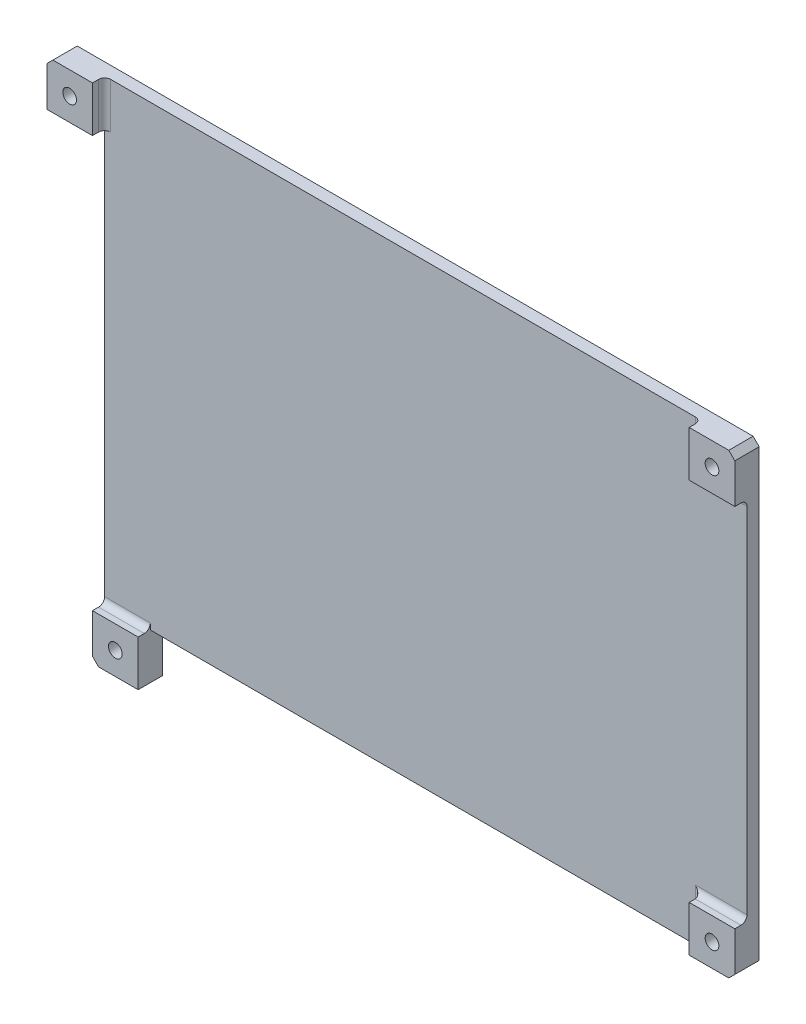
ISO-10303-21;
HEADER;
FILE_DESCRIPTION(('STEP AP214'),'2;1');
FILE_NAME('part.step','',(''),(''),'','','');
FILE_SCHEMA(('AUTOMOTIVE_DESIGN { 1 0 10303 214 1 1 1 1 }'));
ENDSEC;
DATA;
#1=APPLICATION_CONTEXT('core data for automotive mechanical design processes');
#2=APPLICATION_PROTOCOL_DEFINITION('international standard','automotive_design',2000,#1);
#3=PRODUCT_CONTEXT('',#1,'mechanical');
#4=PRODUCT('Part','Part','',(#3));
#5=PRODUCT_RELATED_PRODUCT_CATEGORY('part','',(#4));
#6=PRODUCT_DEFINITION_FORMATION('','',#4);
#7=PRODUCT_DEFINITION_CONTEXT('part definition',#1,'design');
#8=PRODUCT_DEFINITION('design','',#6,#7);
#9=PRODUCT_DEFINITION_SHAPE('','',#8);
#10=(LENGTH_UNIT() NAMED_UNIT(*) SI_UNIT(.MILLI.,.METRE.));
#11=(NAMED_UNIT(*) PLANE_ANGLE_UNIT() SI_UNIT($,.RADIAN.));
#12=(NAMED_UNIT(*) SI_UNIT($,.STERADIAN.) SOLID_ANGLE_UNIT());
#13=UNCERTAINTY_MEASURE_WITH_UNIT(LENGTH_MEASURE(1.E-05),#10,'distance_accuracy_value','');
#14=(GEOMETRIC_REPRESENTATION_CONTEXT(3) GLOBAL_UNCERTAINTY_ASSIGNED_CONTEXT((#13)) GLOBAL_UNIT_ASSIGNED_CONTEXT((#10,
#11,#12)) REPRESENTATION_CONTEXT('',''));
#15=CARTESIAN_POINT('',(0.,0.,0.));
#16=DIRECTION('',(0.,0.,1.));
#17=DIRECTION('',(1.,0.,0.));
#18=AXIS2_PLACEMENT_3D('',#15,#16,#17);
#19=CARTESIAN_POINT('',(0.,0.,2.));
#20=DIRECTION('',(0.,0.,1.));
#21=DIRECTION('',(1.,0.,0.));
#22=AXIS2_PLACEMENT_3D('',#19,#20,#21);
#23=PLANE('',#22);
#24=DIRECTION('',(0.,1.,0.));
#25=VECTOR('',#24,1.);
#26=CARTESIAN_POINT('',(62.0588235294117,24.5025354969574,2.));
#27=LINE('',#26,#25);
#28=CARTESIAN_POINT('',(62.0588235294118,-42.0574645030426,2.));
#29=VERTEX_POINT('',#28);
#30=CARTESIAN_POINT('',(62.0588235294117,16.0025354969574,2.));
#31=VERTEX_POINT('',#30);
#32=EDGE_CURVE('E288',#29,#31,#27,.T.);
#33=ORIENTED_EDGE('',*,*,#32,.T.);
#34=DIRECTION('',(1.,0.,0.));
#35=VECTOR('',#34,1.);
#36=CARTESIAN_POINT('',(0.,16.0025354969574,2.));
#37=LINE('',#36,#35);
#38=CARTESIAN_POINT('',(53.5588235294117,16.0025354969574,2.));
#39=VERTEX_POINT('',#38);
#40=EDGE_CURVE('E428',#31,#39,#37,.F.);
#41=ORIENTED_EDGE('',*,*,#40,.T.);
#42=DIRECTION('',(0.,-1.,0.));
#43=VECTOR('',#42,1.);
#44=CARTESIAN_POINT('',(53.5588235294117,0.,2.));
#45=LINE('',#44,#43);
#46=CARTESIAN_POINT('',(53.5588235294117,24.5025354969574,2.));
#47=VERTEX_POINT('',#46);
#48=EDGE_CURVE('E431',#39,#47,#45,.F.);
#49=ORIENTED_EDGE('',*,*,#48,.T.);
#50=DIRECTION('',(-1.,0.,0.));
#51=VECTOR('',#50,1.);
#52=CARTESIAN_POINT('',(-43.4411764705882,24.5025354969574,2.));
#53=LINE('',#52,#51);
#54=CARTESIAN_POINT('',(-42.4411764705882,24.5025354969574,2.));
#55=VERTEX_POINT('',#54);
#56=EDGE_CURVE('E281',#47,#55,#53,.T.);
#57=ORIENTED_EDGE('',*,*,#56,.T.);
#58=DIRECTION('',(0.,-1.,0.));
#59=VECTOR('',#58,1.);
#60=CARTESIAN_POINT('',(-42.4411764705882,0.,2.));
#61=LINE('',#60,#59);
#62=CARTESIAN_POINT('',(-42.4411764705882,17.0025354969574,2.));
#63=VERTEX_POINT('',#62);
#64=EDGE_CURVE('E278',#55,#63,#61,.T.);
#65=ORIENTED_EDGE('',*,*,#64,.T.);
#66=DIRECTION('',(-1.,0.,0.));
#67=VECTOR('',#66,1.);
#68=CARTESIAN_POINT('',(0.,17.0025354969574,2.));
#69=LINE('',#68,#67);
#70=CARTESIAN_POINT('',(-43.4411764705882,17.0025354969574,2.));
#71=VERTEX_POINT('',#70);
#72=EDGE_CURVE('E269',#63,#71,#69,.T.);
#73=ORIENTED_EDGE('',*,*,#72,.T.);
#74=DIRECTION('',(0.,-1.,0.));
#75=VECTOR('',#74,1.);
#76=CARTESIAN_POINT('',(-43.4411764705882,24.5025354969574,2.));
#77=LINE('',#76,#75);
#78=CARTESIAN_POINT('',(-43.4411764705882,-49.5574645030426,2.));
#79=VERTEX_POINT('',#78);
#80=EDGE_CURVE('E481',#71,#79,#77,.T.);
#81=ORIENTED_EDGE('',*,*,#80,.T.);
#82=DIRECTION('',(1.,0.,0.));
#83=VECTOR('',#82,1.);
#84=CARTESIAN_POINT('',(0.,-49.5574645030426,2.));
#85=LINE('',#84,#83);
#86=CARTESIAN_POINT('',(-35.9411764705882,-49.5574645030426,2.));
#87=VERTEX_POINT('',#86);
#88=EDGE_CURVE('E461',#79,#87,#85,.T.);
#89=ORIENTED_EDGE('',*,*,#88,.T.);
#90=DIRECTION('',(0.,-1.,0.));
#91=VECTOR('',#90,1.);
#92=CARTESIAN_POINT('',(-35.9411764705882,0.,2.));
#93=LINE('',#92,#91);
#94=CARTESIAN_POINT('',(-35.9411764705882,-50.5574645030426,2.));
#95=VERTEX_POINT('',#94);
#96=EDGE_CURVE('E465',#87,#95,#93,.T.);
#97=ORIENTED_EDGE('',*,*,#96,.T.);
#98=DIRECTION('',(1.,0.,0.));
#99=VECTOR('',#98,1.);
#100=CARTESIAN_POINT('',(-43.4411764705882,-50.5574645030426,2.));
#101=LINE('',#100,#99);
#102=CARTESIAN_POINT('',(53.5588235294118,-50.5574645030426,2.));
#103=VERTEX_POINT('',#102);
#104=EDGE_CURVE('E496',#95,#103,#101,.T.);
#105=ORIENTED_EDGE('',*,*,#104,.T.);
#106=DIRECTION('',(0.,-1.,0.));
#107=VECTOR('',#106,1.);
#108=CARTESIAN_POINT('',(53.5588235294117,0.,2.));
#109=LINE('',#108,#107);
#110=CARTESIAN_POINT('',(53.5588235294117,-42.0574645030426,2.));
#111=VERTEX_POINT('',#110);
#112=EDGE_CURVE('E434',#103,#111,#109,.F.);
#113=ORIENTED_EDGE('',*,*,#112,.T.);
#114=DIRECTION('',(-1.,0.,0.));
#115=VECTOR('',#114,1.);
#116=CARTESIAN_POINT('',(0.,-42.0574645030426,2.));
#117=LINE('',#116,#115);
#118=EDGE_CURVE('E437',#111,#29,#117,.F.);
#119=ORIENTED_EDGE('',*,*,#118,.T.);
#120=EDGE_LOOP('',(#33,#41,#49,#57,#65,#73,#81,#89,#97,#105,#113,#119));
#121=FACE_BOUND('',#120,.T.);
#122=ADVANCED_FACE('F47',(#121),#23,.T.);
#123=CARTESIAN_POINT('',(-43.4411764705882,24.5025354969574,2.));
#124=DIRECTION('',(1.,0.,0.));
#125=DIRECTION('',(0.,1.,0.));
#126=AXIS2_PLACEMENT_3D('',#123,#124,#125);
#127=PLANE('',#126);
#128=DIRECTION('',(0.,-1.,0.));
#129=VECTOR('',#128,1.);
#130=CARTESIAN_POINT('',(-43.4411764705882,24.5025354969574,0.));
#131=LINE('',#130,#129);
#132=CARTESIAN_POINT('',(-43.4411764705882,17.0025354969574,0.));
#133=VERTEX_POINT('',#132);
#134=CARTESIAN_POINT('',(-43.4411764705882,-57.0574645030426,0.));
#135=VERTEX_POINT('',#134);
#136=EDGE_CURVE('E489',#133,#135,#131,.T.);
#137=ORIENTED_EDGE('',*,*,#136,.T.);
#138=DIRECTION('',(0.,0.,1.));
#139=VECTOR('',#138,1.);
#140=CARTESIAN_POINT('',(-43.4411764705882,-57.0574645030426,2.));
#141=LINE('',#140,#139);
#142=CARTESIAN_POINT('',(-43.4411764705882,-57.0574645030426,4.));
#143=VERTEX_POINT('',#142);
#144=EDGE_CURVE('E70',#135,#143,#141,.T.);
#145=ORIENTED_EDGE('',*,*,#144,.T.);
#146=DIRECTION('',(0.,-1.,0.));
#147=VECTOR('',#146,1.);
#148=CARTESIAN_POINT('',(-43.4411764705882,-58.0574645030426,4.));
#149=LINE('',#148,#147);
#150=CARTESIAN_POINT('',(-43.4411764705882,-50.5574645030426,4.));
#151=VERTEX_POINT('',#150);
#152=EDGE_CURVE('E239',#151,#143,#149,.T.);
#153=ORIENTED_EDGE('',*,*,#152,.F.);
#154=DIRECTION('',(0.,0.,-1.));
#155=VECTOR('',#154,1.);
#156=CARTESIAN_POINT('',(-43.4411764705882,-50.5574645030426,4.));
#157=LINE('',#156,#155);
#158=CARTESIAN_POINT('',(-43.4411764705882,-50.5574645030426,3.));
#159=VERTEX_POINT('',#158);
#160=EDGE_CURVE('E236',#151,#159,#157,.T.);
#161=ORIENTED_EDGE('',*,*,#160,.T.);
#162=CARTESIAN_POINT('',(-43.4411764705882,-49.5574645030426,3.));
#163=DIRECTION('',(1.,0.,0.));
#164=DIRECTION('',(0.,1.,0.));
#165=AXIS2_PLACEMENT_3D('',#162,#163,#164);
#166=CIRCLE('',#165,1.);
#167=EDGE_CURVE('E450',#159,#79,#166,.T.);
#168=ORIENTED_EDGE('',*,*,#167,.T.);
#169=ORIENTED_EDGE('',*,*,#80,.F.);
#170=DIRECTION('',(0.,0.,-1.));
#171=VECTOR('',#170,1.);
#172=CARTESIAN_POINT('',(-43.4411764705882,17.0025354969574,4.));
#173=LINE('',#172,#171);
#174=EDGE_CURVE('E270',#71,#133,#173,.T.);
#175=ORIENTED_EDGE('',*,*,#174,.T.);
#176=EDGE_LOOP('',(#137,#145,#153,#161,#168,#169,#175));
#177=FACE_BOUND('',#176,.T.);
#178=ADVANCED_FACE('F634',(#177),#127,.F.);
#179=CARTESIAN_POINT('',(-43.4411764705882,-50.5574645030426,2.));
#180=DIRECTION('',(0.,1.,0.));
#181=DIRECTION('',(0.,0.,1.));
#182=AXIS2_PLACEMENT_3D('',#179,#180,#181);
#183=PLANE('',#182);
#184=DIRECTION('',(1.,0.,0.));
#185=VECTOR('',#184,1.);
#186=CARTESIAN_POINT('',(-43.4411764705882,-50.5574645030426,0.));
#187=LINE('',#186,#185);
#188=CARTESIAN_POINT('',(-35.9411764705882,-50.5574645030426,0.));
#189=VERTEX_POINT('',#188);
#190=CARTESIAN_POINT('',(61.0588235294118,-50.5574645030426,0.));
#191=VERTEX_POINT('',#190);
#192=EDGE_CURVE('E486',#189,#191,#187,.T.);
#193=ORIENTED_EDGE('',*,*,#192,.T.);
#194=DIRECTION('',(0.,0.,1.));
#195=VECTOR('',#194,1.);
#196=CARTESIAN_POINT('',(61.0588235294118,-50.5574645030426,2.));
#197=LINE('',#196,#195);
#198=CARTESIAN_POINT('',(61.0588235294118,-50.5574645030426,4.));
#199=VERTEX_POINT('',#198);
#200=EDGE_CURVE('E367',#191,#199,#197,.T.);
#201=ORIENTED_EDGE('',*,*,#200,.T.);
#202=DIRECTION('',(1.,0.,0.));
#203=VECTOR('',#202,1.);
#204=CARTESIAN_POINT('',(54.5588235294117,-50.5574645030426,4.));
#205=LINE('',#204,#203);
#206=CARTESIAN_POINT('',(54.5588235294117,-50.5574645030426,4.));
#207=VERTEX_POINT('',#206);
#208=EDGE_CURVE('E536',#207,#199,#205,.T.);
#209=ORIENTED_EDGE('',*,*,#208,.F.);
#210=DIRECTION('',(0.,0.,-1.));
#211=VECTOR('',#210,1.);
#212=CARTESIAN_POINT('',(54.5588235294117,-50.5574645030426,4.));
#213=LINE('',#212,#211);
#214=CARTESIAN_POINT('',(54.5588235294117,-50.5574645030426,3.));
#215=VERTEX_POINT('',#214);
#216=EDGE_CURVE('E475',#207,#215,#213,.T.);
#217=ORIENTED_EDGE('',*,*,#216,.T.);
#218=CARTESIAN_POINT('',(53.5588235294117,-50.5574645030426,3.));
#219=DIRECTION('',(0.,1.,0.));
#220=DIRECTION('',(0.,0.,1.));
#221=AXIS2_PLACEMENT_3D('',#218,#219,#220);
#222=CIRCLE('',#221,1.);
#223=EDGE_CURVE('E409',#215,#103,#222,.T.);
#224=ORIENTED_EDGE('',*,*,#223,.T.);
#225=ORIENTED_EDGE('',*,*,#104,.F.);
#226=DIRECTION('',(0.,0.,-1.));
#227=VECTOR('',#226,1.);
#228=CARTESIAN_POINT('',(-35.9411764705882,-50.5574645030426,4.));
#229=LINE('',#228,#227);
#230=EDGE_CURVE('E258',#95,#189,#229,.T.);
#231=ORIENTED_EDGE('',*,*,#230,.T.);
#232=EDGE_LOOP('',(#193,#201,#209,#217,#224,#225,#231));
#233=FACE_BOUND('',#232,.T.);
#234=ADVANCED_FACE('F639',(#233),#183,.F.);
#235=CARTESIAN_POINT('',(62.0588235294117,24.5025354969574,2.));
#236=DIRECTION('',(-1.,0.,0.));
#237=DIRECTION('',(0.,-1.,0.));
#238=AXIS2_PLACEMENT_3D('',#235,#236,#237);
#239=PLANE('',#238);
#240=DIRECTION('',(0.,1.,0.));
#241=VECTOR('',#240,1.);
#242=CARTESIAN_POINT('',(62.0588235294117,24.5025354969574,0.));
#243=LINE('',#242,#241);
#244=CARTESIAN_POINT('',(62.0588235294118,-49.5574645030426,0.));
#245=VERTEX_POINT('',#244);
#246=CARTESIAN_POINT('',(62.0588235294117,23.5025354969574,0.));
#247=VERTEX_POINT('',#246);
#248=EDGE_CURVE('E482',#245,#247,#243,.T.);
#249=ORIENTED_EDGE('',*,*,#248,.T.);
#250=DIRECTION('',(0.,0.,1.));
#251=VECTOR('',#250,1.);
#252=CARTESIAN_POINT('',(62.0588235294117,23.5025354969574,2.));
#253=LINE('',#252,#251);
#254=CARTESIAN_POINT('',(62.0588235294117,23.5025354969574,4.));
#255=VERTEX_POINT('',#254);
#256=EDGE_CURVE('E373',#247,#255,#253,.T.);
#257=ORIENTED_EDGE('',*,*,#256,.T.);
#258=DIRECTION('',(0.,1.,0.));
#259=VECTOR('',#258,1.);
#260=CARTESIAN_POINT('',(62.0588235294117,24.5025354969574,4.));
#261=LINE('',#260,#259);
#262=CARTESIAN_POINT('',(62.0588235294117,17.0025354969574,4.));
#263=VERTEX_POINT('',#262);
#264=EDGE_CURVE('E517',#263,#255,#261,.T.);
#265=ORIENTED_EDGE('',*,*,#264,.F.);
#266=DIRECTION('',(0.,0.,-1.));
#267=VECTOR('',#266,1.);
#268=CARTESIAN_POINT('',(62.0588235294117,17.0025354969574,4.));
#269=LINE('',#268,#267);
#270=CARTESIAN_POINT('',(62.0588235294117,17.0025354969574,3.));
#271=VERTEX_POINT('',#270);
#272=EDGE_CURVE('E506',#263,#271,#269,.T.);
#273=ORIENTED_EDGE('',*,*,#272,.T.);
#274=CARTESIAN_POINT('',(62.0588235294117,16.0025354969574,3.));
#275=DIRECTION('',(-1.,0.,0.));
#276=DIRECTION('',(0.,-1.,0.));
#277=AXIS2_PLACEMENT_3D('',#274,#275,#276);
#278=CIRCLE('',#277,1.);
#279=EDGE_CURVE('E415',#271,#31,#278,.T.);
#280=ORIENTED_EDGE('',*,*,#279,.T.);
#281=ORIENTED_EDGE('',*,*,#32,.F.);
#282=CARTESIAN_POINT('',(62.0588235294118,-42.0574645030426,3.));
#283=DIRECTION('',(-1.,0.,0.));
#284=DIRECTION('',(0.,-1.,0.));
#285=AXIS2_PLACEMENT_3D('',#282,#283,#284);
#286=CIRCLE('',#285,1.);
#287=CARTESIAN_POINT('',(62.0588235294117,-43.0574645030426,3.));
#288=VERTEX_POINT('',#287);
#289=EDGE_CURVE('E397',#29,#288,#286,.T.);
#290=ORIENTED_EDGE('',*,*,#289,.T.);
#291=DIRECTION('',(0.,0.,-1.));
#292=VECTOR('',#291,1.);
#293=CARTESIAN_POINT('',(62.0588235294117,-43.0574645030426,4.));
#294=LINE('',#293,#292);
#295=CARTESIAN_POINT('',(62.0588235294117,-43.0574645030426,4.));
#296=VERTEX_POINT('',#295);
#297=EDGE_CURVE('E550',#296,#288,#294,.T.);
#298=ORIENTED_EDGE('',*,*,#297,.F.);
#299=DIRECTION('',(0.,1.,0.));
#300=VECTOR('',#299,1.);
#301=CARTESIAN_POINT('',(62.0588235294117,-50.5574645030426,4.));
#302=LINE('',#301,#300);
#303=CARTESIAN_POINT('',(62.0588235294117,-49.5574645030426,4.));
#304=VERTEX_POINT('',#303);
#305=EDGE_CURVE('E540',#304,#296,#302,.T.);
#306=ORIENTED_EDGE('',*,*,#305,.F.);
#307=DIRECTION('',(0.,0.,-1.));
#308=VECTOR('',#307,1.);
#309=CARTESIAN_POINT('',(62.0588235294118,-49.5574645030426,2.));
#310=LINE('',#309,#308);
#311=EDGE_CURVE('E376',#304,#245,#310,.T.);
#312=ORIENTED_EDGE('',*,*,#311,.T.);
#313=EDGE_LOOP('',(#249,#257,#265,#273,#280,#281,#290,#298,#306,#312));
#314=FACE_BOUND('',#313,.T.);
#315=ADVANCED_FACE('F587',(#314),#239,.F.);
#316=CARTESIAN_POINT('',(-43.4411764705882,24.5025354969574,2.));
#317=DIRECTION('',(0.,-1.,0.));
#318=DIRECTION('',(0.,0.,-1.));
#319=AXIS2_PLACEMENT_3D('',#316,#317,#318);
#320=PLANE('',#319);
#321=DIRECTION('',(-1.,0.,0.));
#322=VECTOR('',#321,1.);
#323=CARTESIAN_POINT('',(54.5588235294117,24.5025354969574,4.));
#324=LINE('',#323,#322);
#325=CARTESIAN_POINT('',(61.0588235294118,24.5025354969574,4.));
#326=VERTEX_POINT('',#325);
#327=CARTESIAN_POINT('',(54.5588235294117,24.5025354969574,4.));
#328=VERTEX_POINT('',#327);
#329=EDGE_CURVE('E514',#326,#328,#324,.T.);
#330=ORIENTED_EDGE('',*,*,#329,.F.);
#331=DIRECTION('',(0.,0.,-1.));
#332=VECTOR('',#331,1.);
#333=CARTESIAN_POINT('',(61.0588235294118,24.5025354969574,2.));
#334=LINE('',#333,#332);
#335=CARTESIAN_POINT('',(61.0588235294118,24.5025354969574,0.));
#336=VERTEX_POINT('',#335);
#337=EDGE_CURVE('E391',#326,#336,#334,.T.);
#338=ORIENTED_EDGE('',*,*,#337,.T.);
#339=DIRECTION('',(-1.,0.,0.));
#340=VECTOR('',#339,1.);
#341=CARTESIAN_POINT('',(-43.4411764705882,24.5025354969574,0.));
#342=LINE('',#341,#340);
#343=CARTESIAN_POINT('',(-49.9411764705882,24.5025354969574,0.));
#344=VERTEX_POINT('',#343);
#345=EDGE_CURVE('E477',#336,#344,#342,.T.);
#346=ORIENTED_EDGE('',*,*,#345,.T.);
#347=DIRECTION('',(0.,0.,1.));
#348=VECTOR('',#347,1.);
#349=CARTESIAN_POINT('',(-49.9411764705882,24.5025354969574,2.));
#350=LINE('',#349,#348);
#351=CARTESIAN_POINT('',(-49.9411764705882,24.5025354969574,4.));
#352=VERTEX_POINT('',#351);
#353=EDGE_CURVE('E348',#344,#352,#350,.T.);
#354=ORIENTED_EDGE('',*,*,#353,.T.);
#355=DIRECTION('',(-1.,0.,0.));
#356=VECTOR('',#355,1.);
#357=CARTESIAN_POINT('',(-50.9411764705882,24.5025354969574,4.));
#358=LINE('',#357,#356);
#359=CARTESIAN_POINT('',(-43.4411764705882,24.5025354969574,4.));
#360=VERTEX_POINT('',#359);
#361=EDGE_CURVE('E305',#360,#352,#358,.T.);
#362=ORIENTED_EDGE('',*,*,#361,.F.);
#363=DIRECTION('',(0.,0.,-1.));
#364=VECTOR('',#363,1.);
#365=CARTESIAN_POINT('',(-43.4411764705882,24.5025354969574,4.));
#366=LINE('',#365,#364);
#367=CARTESIAN_POINT('',(-43.4411764705882,24.5025354969574,3.));
#368=VERTEX_POINT('',#367);
#369=EDGE_CURVE('E295',#360,#368,#366,.T.);
#370=ORIENTED_EDGE('',*,*,#369,.T.);
#371=CARTESIAN_POINT('',(-42.4411764705882,24.5025354969574,3.));
#372=DIRECTION('',(0.,-1.,0.));
#373=DIRECTION('',(0.,0.,-1.));
#374=AXIS2_PLACEMENT_3D('',#371,#372,#373);
#375=CIRCLE('',#374,1.);
#376=EDGE_CURVE('E444',#368,#55,#375,.T.);
#377=ORIENTED_EDGE('',*,*,#376,.T.);
#378=ORIENTED_EDGE('',*,*,#56,.F.);
#379=CARTESIAN_POINT('',(53.5588235294117,24.5025354969574,3.));
#380=DIRECTION('',(0.,-1.,0.));
#381=DIRECTION('',(0.,0.,-1.));
#382=AXIS2_PLACEMENT_3D('',#379,#380,#381);
#383=CIRCLE('',#382,1.);
#384=CARTESIAN_POINT('',(54.5588235294117,24.5025354969574,3.));
#385=VERTEX_POINT('',#384);
#386=EDGE_CURVE('E412',#47,#385,#383,.T.);
#387=ORIENTED_EDGE('',*,*,#386,.T.);
#388=DIRECTION('',(0.,0.,-1.));
#389=VECTOR('',#388,1.);
#390=CARTESIAN_POINT('',(54.5588235294117,24.5025354969574,4.));
#391=LINE('',#390,#389);
#392=EDGE_CURVE('E510',#328,#385,#391,.T.);
#393=ORIENTED_EDGE('',*,*,#392,.F.);
#394=EDGE_LOOP('',(#330,#338,#346,#354,#362,#370,#377,#378,#387,#393));
#395=FACE_BOUND('',#394,.T.);
#396=ADVANCED_FACE('F597',(#395),#320,.F.);
#397=CARTESIAN_POINT('',(0.,0.,0.));
#398=DIRECTION('',(0.,0.,1.));
#399=DIRECTION('',(1.,0.,0.));
#400=AXIS2_PLACEMENT_3D('',#397,#398,#399);
#401=PLANE('',#400);
#402=CARTESIAN_POINT('',(-39.6911764705882,-54.3074645030426,0.));
#403=DIRECTION('',(0.,0.,1.));
#404=DIRECTION('',(1.,0.,0.));
#405=AXIS2_PLACEMENT_3D('',#402,#403,#404);
#406=CIRCLE('',#405,1.125);
#407=CARTESIAN_POINT('',(-38.5661764705882,-54.3074645030426,0.));
#408=VERTEX_POINT('',#407);
#409=EDGE_CURVE('E704',#408,#408,#406,.T.);
#410=ORIENTED_EDGE('',*,*,#409,.T.);
#411=EDGE_LOOP('',(#410));
#412=FACE_BOUND('',#411,.T.);
#413=CARTESIAN_POINT('',(-47.1911764705882,20.7525354969574,0.));
#414=DIRECTION('',(0.,0.,1.));
#415=DIRECTION('',(1.,0.,0.));
#416=AXIS2_PLACEMENT_3D('',#413,#414,#415);
#417=CIRCLE('',#416,1.125);
#418=CARTESIAN_POINT('',(-46.0661764705882,20.7525354969574,0.));
#419=VERTEX_POINT('',#418);
#420=EDGE_CURVE('E262',#419,#419,#417,.T.);
#421=ORIENTED_EDGE('',*,*,#420,.T.);
#422=EDGE_LOOP('',(#421));
#423=FACE_BOUND('',#422,.T.);
#424=CARTESIAN_POINT('',(58.3088235294117,-46.8074645030426,0.));
#425=DIRECTION('',(0.,0.,1.));
#426=DIRECTION('',(1.,0.,0.));
#427=AXIS2_PLACEMENT_3D('',#424,#425,#426);
#428=CIRCLE('',#427,1.125);
#429=CARTESIAN_POINT('',(59.4338235294117,-46.8074645030426,0.));
#430=VERTEX_POINT('',#429);
#431=EDGE_CURVE('E476',#430,#430,#428,.T.);
#432=ORIENTED_EDGE('',*,*,#431,.T.);
#433=EDGE_LOOP('',(#432));
#434=FACE_BOUND('',#433,.T.);
#435=CARTESIAN_POINT('',(58.3088235294118,20.7525354969574,0.));
#436=DIRECTION('',(0.,0.,1.));
#437=DIRECTION('',(1.,0.,0.));
#438=AXIS2_PLACEMENT_3D('',#435,#436,#437);
#439=CIRCLE('',#438,1.125);
#440=CARTESIAN_POINT('',(59.4338235294118,20.7525354969574,0.));
#441=VERTEX_POINT('',#440);
#442=EDGE_CURVE('E471',#441,#441,#439,.T.);
#443=ORIENTED_EDGE('',*,*,#442,.T.);
#444=EDGE_LOOP('',(#443));
#445=FACE_BOUND('',#444,.T.);
#446=ORIENTED_EDGE('',*,*,#345,.F.);
#447=DIRECTION('',(-0.707106781186548,0.707106781186548,0.));
#448=VECTOR('',#447,1.);
#449=CARTESIAN_POINT('',(61.0588235294118,24.5025354969574,0.));
#450=LINE('',#449,#448);
#451=EDGE_CURVE('E380',#336,#247,#450,.F.);
#452=ORIENTED_EDGE('',*,*,#451,.T.);
#453=ORIENTED_EDGE('',*,*,#248,.F.);
#454=DIRECTION('',(0.707106781186545,0.70710678118655,0.));
#455=VECTOR('',#454,1.);
#456=CARTESIAN_POINT('',(62.0588235294118,-49.5574645030426,0.));
#457=LINE('',#456,#455);
#458=EDGE_CURVE('E383',#245,#191,#457,.F.);
#459=ORIENTED_EDGE('',*,*,#458,.T.);
#460=ORIENTED_EDGE('',*,*,#192,.F.);
#461=DIRECTION('',(0.,1.,0.));
#462=VECTOR('',#461,1.);
#463=CARTESIAN_POINT('',(-35.9411764705882,-58.0574645030426,0.));
#464=LINE('',#463,#462);
#465=CARTESIAN_POINT('',(-35.9411764705882,-58.0574645030426,0.));
#466=VERTEX_POINT('',#465);
#467=EDGE_CURVE('E701',#466,#189,#464,.T.);
#468=ORIENTED_EDGE('',*,*,#467,.F.);
#469=DIRECTION('',(1.,0.,0.));
#470=VECTOR('',#469,1.);
#471=CARTESIAN_POINT('',(-35.9411764705882,-58.0574645030426,0.));
#472=LINE('',#471,#470);
#473=CARTESIAN_POINT('',(-42.4411764705882,-58.0574645030426,0.));
#474=VERTEX_POINT('',#473);
#475=EDGE_CURVE('E250',#474,#466,#472,.T.);
#476=ORIENTED_EDGE('',*,*,#475,.F.);
#477=DIRECTION('',(0.707106781186545,-0.70710678118655,0.));
#478=VECTOR('',#477,1.);
#479=CARTESIAN_POINT('',(-42.4411764705882,-58.0574645030426,0.));
#480=LINE('',#479,#478);
#481=EDGE_CURVE('E386',#474,#135,#480,.F.);
#482=ORIENTED_EDGE('',*,*,#481,.T.);
#483=ORIENTED_EDGE('',*,*,#136,.F.);
#484=DIRECTION('',(1.,0.,0.));
#485=VECTOR('',#484,1.);
#486=CARTESIAN_POINT('',(-50.9411764705882,17.0025354969574,0.));
#487=LINE('',#486,#485);
#488=CARTESIAN_POINT('',(-50.9411764705882,17.0025354969574,0.));
#489=VERTEX_POINT('',#488);
#490=EDGE_CURVE('E315',#489,#133,#487,.T.);
#491=ORIENTED_EDGE('',*,*,#490,.F.);
#492=DIRECTION('',(0.,-1.,0.));
#493=VECTOR('',#492,1.);
#494=CARTESIAN_POINT('',(-50.9411764705882,24.5025354969574,0.));
#495=LINE('',#494,#493);
#496=CARTESIAN_POINT('',(-50.9411764705882,23.5025354969574,0.));
#497=VERTEX_POINT('',#496);
#498=EDGE_CURVE('E319',#497,#489,#495,.T.);
#499=ORIENTED_EDGE('',*,*,#498,.F.);
#500=DIRECTION('',(-0.707106781186548,-0.707106781186548,0.));
#501=VECTOR('',#500,1.);
#502=CARTESIAN_POINT('',(-50.9411764705882,23.5025354969574,0.));
#503=LINE('',#502,#501);
#504=EDGE_CURVE('E350',#497,#344,#503,.F.);
#505=ORIENTED_EDGE('',*,*,#504,.T.);
#506=EDGE_LOOP('',(#446,#452,#453,#459,#460,#468,#476,#482,#483,#491,#499,#505));
#507=FACE_BOUND('',#506,.T.);
#508=ADVANCED_FACE('F332',(#412,#423,#434,#445,#507),#401,.F.);
#509=CARTESIAN_POINT('',(0.,0.,4.));
#510=DIRECTION('',(0.,0.,1.));
#511=DIRECTION('',(1.,0.,0.));
#512=AXIS2_PLACEMENT_3D('',#509,#510,#511);
#513=PLANE('',#512);
#514=ORIENTED_EDGE('',*,*,#264,.T.);
#515=DIRECTION('',(0.707106781186548,-0.707106781186548,0.));
#516=VECTOR('',#515,1.);
#517=CARTESIAN_POINT('',(42.7806795131846,42.7806795131846,4.));
#518=LINE('',#517,#516);
#519=EDGE_CURVE('E370',#255,#326,#518,.F.);
#520=ORIENTED_EDGE('',*,*,#519,.T.);
#521=ORIENTED_EDGE('',*,*,#329,.T.);
#522=DIRECTION('',(0.,-1.,0.));
#523=VECTOR('',#522,1.);
#524=CARTESIAN_POINT('',(54.5588235294117,24.5025354969574,4.));
#525=LINE('',#524,#523);
#526=CARTESIAN_POINT('',(54.5588235294117,17.0025354969574,4.));
#527=VERTEX_POINT('',#526);
#528=EDGE_CURVE('E524',#328,#527,#525,.T.);
#529=ORIENTED_EDGE('',*,*,#528,.T.);
#530=DIRECTION('',(1.,0.,0.));
#531=VECTOR('',#530,1.);
#532=CARTESIAN_POINT('',(54.5588235294117,17.0025354969574,4.));
#533=LINE('',#532,#531);
#534=EDGE_CURVE('E521',#527,#263,#533,.T.);
#535=ORIENTED_EDGE('',*,*,#534,.T.);
#536=EDGE_LOOP('',(#514,#520,#521,#529,#535));
#537=FACE_BOUND('',#536,.T.);
#538=CARTESIAN_POINT('',(58.3088235294118,20.7525354969574,4.));
#539=DIRECTION('',(0.,0.,1.));
#540=DIRECTION('',(1.,0.,0.));
#541=AXIS2_PLACEMENT_3D('',#538,#539,#540);
#542=CIRCLE('',#541,1.125);
#543=CARTESIAN_POINT('',(59.4338235294118,20.7525354969574,4.));
#544=VERTEX_POINT('',#543);
#545=EDGE_CURVE('E528',#544,#544,#542,.T.);
#546=ORIENTED_EDGE('',*,*,#545,.F.);
#547=EDGE_LOOP('',(#546));
#548=FACE_BOUND('',#547,.T.);
#549=ADVANCED_FACE('F601',(#537,#548),#513,.T.);
#550=CARTESIAN_POINT('',(54.5588235294117,24.5025354969574,4.));
#551=DIRECTION('',(1.,0.,0.));
#552=DIRECTION('',(0.,0.,-1.));
#553=AXIS2_PLACEMENT_3D('',#550,#551,#552);
#554=PLANE('',#553);
#555=ORIENTED_EDGE('',*,*,#392,.T.);
#556=DIRECTION('',(0.,-1.,0.));
#557=VECTOR('',#556,1.);
#558=CARTESIAN_POINT('',(54.5588235294117,24.5025354969574,3.));
#559=LINE('',#558,#557);
#560=CARTESIAN_POINT('',(54.5588235294117,17.0025354969574,3.));
#561=VERTEX_POINT('',#560);
#562=EDGE_CURVE('E425',#385,#561,#559,.T.);
#563=ORIENTED_EDGE('',*,*,#562,.T.);
#564=DIRECTION('',(0.,0.,-1.));
#565=VECTOR('',#564,1.);
#566=CARTESIAN_POINT('',(54.5588235294117,17.0025354969574,4.));
#567=LINE('',#566,#565);
#568=EDGE_CURVE('E491',#527,#561,#567,.T.);
#569=ORIENTED_EDGE('',*,*,#568,.F.);
#570=ORIENTED_EDGE('',*,*,#528,.F.);
#571=EDGE_LOOP('',(#555,#563,#569,#570));
#572=FACE_BOUND('',#571,.T.);
#573=ADVANCED_FACE('F622',(#572),#554,.F.);
#574=CARTESIAN_POINT('',(54.5588235294117,17.0025354969574,4.));
#575=DIRECTION('',(0.,1.,0.));
#576=DIRECTION('',(0.,0.,1.));
#577=AXIS2_PLACEMENT_3D('',#574,#575,#576);
#578=PLANE('',#577);
#579=ORIENTED_EDGE('',*,*,#568,.T.);
#580=DIRECTION('',(1.,0.,0.));
#581=VECTOR('',#580,1.);
#582=CARTESIAN_POINT('',(54.5588235294117,17.0025354969574,3.));
#583=LINE('',#582,#581);
#584=EDGE_CURVE('E440',#561,#271,#583,.T.);
#585=ORIENTED_EDGE('',*,*,#584,.T.);
#586=ORIENTED_EDGE('',*,*,#272,.F.);
#587=ORIENTED_EDGE('',*,*,#534,.F.);
#588=EDGE_LOOP('',(#579,#585,#586,#587));
#589=FACE_BOUND('',#588,.T.);
#590=ADVANCED_FACE('F608',(#589),#578,.F.);
#591=CARTESIAN_POINT('',(58.3088235294118,20.7525354969574,4.));
#592=DIRECTION('',(0.,0.,-1.));
#593=DIRECTION('',(-1.,0.,0.));
#594=AXIS2_PLACEMENT_3D('',#591,#592,#593);
#595=CYLINDRICAL_SURFACE('',#594,1.125);
#596=ORIENTED_EDGE('',*,*,#545,.T.);
#597=EDGE_LOOP('',(#596));
#598=FACE_BOUND('',#597,.T.);
#599=ORIENTED_EDGE('',*,*,#442,.F.);
#600=EDGE_LOOP('',(#599));
#601=FACE_BOUND('',#600,.T.);
#602=ADVANCED_FACE('F629',(#598,#601),#595,.F.);
#603=CARTESIAN_POINT('',(54.5588235294117,-50.5574645030426,4.));
#604=DIRECTION('',(1.,0.,0.));
#605=DIRECTION('',(0.,0.,-1.));
#606=AXIS2_PLACEMENT_3D('',#603,#604,#605);
#607=PLANE('',#606);
#608=DIRECTION('',(0.,0.,-1.));
#609=VECTOR('',#608,1.);
#610=CARTESIAN_POINT('',(54.5588235294117,-43.0574645030426,4.));
#611=LINE('',#610,#609);
#612=CARTESIAN_POINT('',(54.5588235294117,-43.0574645030426,4.));
#613=VERTEX_POINT('',#612);
#614=CARTESIAN_POINT('',(54.5588235294117,-43.0574645030426,3.));
#615=VERTEX_POINT('',#614);
#616=EDGE_CURVE('E546',#613,#615,#611,.T.);
#617=ORIENTED_EDGE('',*,*,#616,.T.);
#618=DIRECTION('',(0.,-1.,0.));
#619=VECTOR('',#618,1.);
#620=CARTESIAN_POINT('',(54.5588235294117,-50.5574645030426,3.));
#621=LINE('',#620,#619);
#622=EDGE_CURVE('E421',#615,#215,#621,.T.);
#623=ORIENTED_EDGE('',*,*,#622,.T.);
#624=ORIENTED_EDGE('',*,*,#216,.F.);
#625=DIRECTION('',(0.,-1.,0.));
#626=VECTOR('',#625,1.);
#627=CARTESIAN_POINT('',(54.5588235294117,-50.5574645030426,4.));
#628=LINE('',#627,#626);
#629=EDGE_CURVE('E532',#613,#207,#628,.T.);
#630=ORIENTED_EDGE('',*,*,#629,.F.);
#631=EDGE_LOOP('',(#617,#623,#624,#630));
#632=FACE_BOUND('',#631,.T.);
#633=ADVANCED_FACE('F717',(#632),#607,.F.);
#634=CARTESIAN_POINT('',(54.5588235294117,-43.0574645030426,4.));
#635=DIRECTION('',(0.,-1.,0.));
#636=DIRECTION('',(0.,0.,-1.));
#637=AXIS2_PLACEMENT_3D('',#634,#635,#636);
#638=PLANE('',#637);
#639=ORIENTED_EDGE('',*,*,#297,.T.);
#640=DIRECTION('',(-1.,0.,0.));
#641=VECTOR('',#640,1.);
#642=CARTESIAN_POINT('',(54.5588235294117,-43.0574645030426,3.));
#643=LINE('',#642,#641);
#644=EDGE_CURVE('E418',#288,#615,#643,.T.);
#645=ORIENTED_EDGE('',*,*,#644,.T.);
#646=ORIENTED_EDGE('',*,*,#616,.F.);
#647=DIRECTION('',(-1.,0.,0.));
#648=VECTOR('',#647,1.);
#649=CARTESIAN_POINT('',(54.5588235294117,-43.0574645030426,4.));
#650=LINE('',#649,#648);
#651=EDGE_CURVE('E543',#296,#613,#650,.T.);
#652=ORIENTED_EDGE('',*,*,#651,.F.);
#653=EDGE_LOOP('',(#639,#645,#646,#652));
#654=FACE_BOUND('',#653,.T.);
#655=ADVANCED_FACE('F575',(#654),#638,.F.);
#656=CARTESIAN_POINT('',(0.,0.,4.));
#657=DIRECTION('',(0.,0.,-1.));
#658=DIRECTION('',(-1.,0.,0.));
#659=AXIS2_PLACEMENT_3D('',#656,#657,#658);
#660=PLANE('',#659);
#661=CARTESIAN_POINT('',(58.3088235294117,-46.8074645030426,4.));
#662=DIRECTION('',(0.,0.,1.));
#663=DIRECTION('',(1.,0.,0.));
#664=AXIS2_PLACEMENT_3D('',#661,#662,#663);
#665=CIRCLE('',#664,1.125);
#666=CARTESIAN_POINT('',(59.4338235294117,-46.8074645030426,4.));
#667=VERTEX_POINT('',#666);
#668=EDGE_CURVE('E303',#667,#667,#665,.T.);
#669=ORIENTED_EDGE('',*,*,#668,.F.);
#670=EDGE_LOOP('',(#669));
#671=FACE_BOUND('',#670,.T.);
#672=ORIENTED_EDGE('',*,*,#208,.T.);
#673=DIRECTION('',(-0.707106781186545,-0.70710678118655,0.));
#674=VECTOR('',#673,1.);
#675=CARTESIAN_POINT('',(62.0588235294118,-49.5574645030426,4.));
#676=LINE('',#675,#674);
#677=EDGE_CURVE('E364',#199,#304,#676,.F.);
#678=ORIENTED_EDGE('',*,*,#677,.T.);
#679=ORIENTED_EDGE('',*,*,#305,.T.);
#680=ORIENTED_EDGE('',*,*,#651,.T.);
#681=ORIENTED_EDGE('',*,*,#629,.T.);
#682=EDGE_LOOP('',(#672,#678,#679,#680,#681));
#683=FACE_BOUND('',#682,.T.);
#684=ADVANCED_FACE('F569',(#671,#683),#660,.F.);
#685=CARTESIAN_POINT('',(58.3088235294117,-46.8074645030426,0.));
#686=DIRECTION('',(0.,0.,1.));
#687=DIRECTION('',(1.,0.,0.));
#688=AXIS2_PLACEMENT_3D('',#685,#686,#687);
#689=CYLINDRICAL_SURFACE('',#688,1.125);
#690=ORIENTED_EDGE('',*,*,#431,.F.);
#691=EDGE_LOOP('',(#690));
#692=FACE_BOUND('',#691,.T.);
#693=ORIENTED_EDGE('',*,*,#668,.T.);
#694=EDGE_LOOP('',(#693));
#695=FACE_BOUND('',#694,.T.);
#696=ADVANCED_FACE('F565',(#692,#695),#689,.F.);
#697=CARTESIAN_POINT('',(-50.9411764705882,24.5025354969574,4.));
#698=DIRECTION('',(1.,0.,0.));
#699=DIRECTION('',(0.,0.,-1.));
#700=AXIS2_PLACEMENT_3D('',#697,#698,#699);
#701=PLANE('',#700);
#702=DIRECTION('',(0.,-1.,0.));
#703=VECTOR('',#702,1.);
#704=CARTESIAN_POINT('',(-50.9411764705882,24.5025354969574,4.));
#705=LINE('',#704,#703);
#706=CARTESIAN_POINT('',(-50.9411764705882,23.5025354969574,4.));
#707=VERTEX_POINT('',#706);
#708=CARTESIAN_POINT('',(-50.9411764705882,17.0025354969574,4.));
#709=VERTEX_POINT('',#708);
#710=EDGE_CURVE('E318',#707,#709,#705,.T.);
#711=ORIENTED_EDGE('',*,*,#710,.F.);
#712=DIRECTION('',(0.,0.,-1.));
#713=VECTOR('',#712,1.);
#714=CARTESIAN_POINT('',(-50.9411764705882,23.5025354969574,4.));
#715=LINE('',#714,#713);
#716=EDGE_CURVE('E57',#707,#497,#715,.T.);
#717=ORIENTED_EDGE('',*,*,#716,.T.);
#718=ORIENTED_EDGE('',*,*,#498,.T.);
#719=DIRECTION('',(0.,0.,-1.));
#720=VECTOR('',#719,1.);
#721=CARTESIAN_POINT('',(-50.9411764705882,17.0025354969574,4.));
#722=LINE('',#721,#720);
#723=EDGE_CURVE('E294',#709,#489,#722,.T.);
#724=ORIENTED_EDGE('',*,*,#723,.F.);
#725=EDGE_LOOP('',(#711,#717,#718,#724));
#726=FACE_BOUND('',#725,.T.);
#727=ADVANCED_FACE('F568',(#726),#701,.F.);
#728=CARTESIAN_POINT('',(-50.9411764705882,17.0025354969574,4.));
#729=DIRECTION('',(0.,1.,0.));
#730=DIRECTION('',(0.,0.,1.));
#731=AXIS2_PLACEMENT_3D('',#728,#729,#730);
#732=PLANE('',#731);
#733=ORIENTED_EDGE('',*,*,#490,.T.);
#734=ORIENTED_EDGE('',*,*,#174,.F.);
#735=ORIENTED_EDGE('',*,*,#72,.F.);
#736=CARTESIAN_POINT('',(-42.4411764705882,17.0025354969574,3.));
#737=DIRECTION('',(0.,1.,0.));
#738=DIRECTION('',(0.,0.,1.));
#739=AXIS2_PLACEMENT_3D('',#736,#737,#738);
#740=CIRCLE('',#739,1.);
#741=CARTESIAN_POINT('',(-43.4411764705882,17.0025354969574,3.));
#742=VERTEX_POINT('',#741);
#743=EDGE_CURVE('E447',#63,#742,#740,.T.);
#744=ORIENTED_EDGE('',*,*,#743,.T.);
#745=CARTESIAN_POINT('',(-43.4411764705882,17.0025354969574,4.));
#746=VERTEX_POINT('',#745);
#747=EDGE_CURVE('E283',#746,#742,#173,.T.);
#748=ORIENTED_EDGE('',*,*,#747,.F.);
#749=DIRECTION('',(1.,0.,0.));
#750=VECTOR('',#749,1.);
#751=CARTESIAN_POINT('',(-50.9411764705882,17.0025354969574,4.));
#752=LINE('',#751,#750);
#753=EDGE_CURVE('E324',#709,#746,#752,.T.);
#754=ORIENTED_EDGE('',*,*,#753,.F.);
#755=ORIENTED_EDGE('',*,*,#723,.T.);
#756=EDGE_LOOP('',(#733,#734,#735,#744,#748,#754,#755));
#757=FACE_BOUND('',#756,.T.);
#758=ADVANCED_FACE('F730',(#757),#732,.F.);
#759=CARTESIAN_POINT('',(-43.4411764705882,24.5025354969574,4.));
#760=DIRECTION('',(-1.,0.,0.));
#761=DIRECTION('',(0.,0.,1.));
#762=AXIS2_PLACEMENT_3D('',#759,#760,#761);
#763=PLANE('',#762);
#764=ORIENTED_EDGE('',*,*,#747,.T.);
#765=DIRECTION('',(0.,-1.,0.));
#766=VECTOR('',#765,1.);
#767=CARTESIAN_POINT('',(-43.4411764705882,24.5025354969574,3.));
#768=LINE('',#767,#766);
#769=EDGE_CURVE('E455',#742,#368,#768,.F.);
#770=ORIENTED_EDGE('',*,*,#769,.T.);
#771=ORIENTED_EDGE('',*,*,#369,.F.);
#772=DIRECTION('',(0.,1.,0.));
#773=VECTOR('',#772,1.);
#774=CARTESIAN_POINT('',(-43.4411764705882,24.5025354969574,4.));
#775=LINE('',#774,#773);
#776=EDGE_CURVE('E312',#746,#360,#775,.T.);
#777=ORIENTED_EDGE('',*,*,#776,.F.);
#778=EDGE_LOOP('',(#764,#770,#771,#777));
#779=FACE_BOUND('',#778,.T.);
#780=ADVANCED_FACE('F343',(#779),#763,.F.);
#781=CARTESIAN_POINT('',(0.,0.,4.));
#782=DIRECTION('',(0.,0.,1.));
#783=DIRECTION('',(1.,0.,0.));
#784=AXIS2_PLACEMENT_3D('',#781,#782,#783);
#785=PLANE('',#784);
#786=CARTESIAN_POINT('',(-47.1911764705882,20.7525354969574,4.));
#787=DIRECTION('',(0.,0.,1.));
#788=DIRECTION('',(1.,0.,0.));
#789=AXIS2_PLACEMENT_3D('',#786,#787,#788);
#790=CIRCLE('',#789,1.125);
#791=CARTESIAN_POINT('',(-46.0661764705882,20.7525354969574,4.));
#792=VERTEX_POINT('',#791);
#793=EDGE_CURVE('E256',#792,#792,#790,.T.);
#794=ORIENTED_EDGE('',*,*,#793,.F.);
#795=EDGE_LOOP('',(#794));
#796=FACE_BOUND('',#795,.T.);
#797=ORIENTED_EDGE('',*,*,#361,.T.);
#798=DIRECTION('',(0.707106781186548,0.707106781186548,0.));
#799=VECTOR('',#798,1.);
#800=CARTESIAN_POINT('',(-37.2218559837728,37.2218559837728,4.));
#801=LINE('',#800,#799);
#802=EDGE_CURVE('E11',#352,#707,#801,.F.);
#803=ORIENTED_EDGE('',*,*,#802,.T.);
#804=ORIENTED_EDGE('',*,*,#710,.T.);
#805=ORIENTED_EDGE('',*,*,#753,.T.);
#806=ORIENTED_EDGE('',*,*,#776,.T.);
#807=EDGE_LOOP('',(#797,#803,#804,#805,#806));
#808=FACE_BOUND('',#807,.T.);
#809=ADVANCED_FACE('F338',(#796,#808),#785,.T.);
#810=CARTESIAN_POINT('',(-47.1911764705882,20.7525354969574,0.));
#811=DIRECTION('',(0.,0.,1.));
#812=DIRECTION('',(1.,0.,0.));
#813=AXIS2_PLACEMENT_3D('',#810,#811,#812);
#814=CYLINDRICAL_SURFACE('',#813,1.125);
#815=ORIENTED_EDGE('',*,*,#420,.F.);
#816=EDGE_LOOP('',(#815));
#817=FACE_BOUND('',#816,.T.);
#818=ORIENTED_EDGE('',*,*,#793,.T.);
#819=EDGE_LOOP('',(#818));
#820=FACE_BOUND('',#819,.T.);
#821=ADVANCED_FACE('F335',(#817,#820),#814,.F.);
#822=CARTESIAN_POINT('',(-35.9411764705882,-58.0574645030426,4.));
#823=DIRECTION('',(-1.,0.,0.));
#824=DIRECTION('',(0.,0.,1.));
#825=AXIS2_PLACEMENT_3D('',#822,#823,#824);
#826=PLANE('',#825);
#827=ORIENTED_EDGE('',*,*,#467,.T.);
#828=ORIENTED_EDGE('',*,*,#230,.F.);
#829=ORIENTED_EDGE('',*,*,#96,.F.);
#830=CARTESIAN_POINT('',(-35.9411764705882,-49.5574645030426,3.));
#831=DIRECTION('',(-1.,0.,0.));
#832=DIRECTION('',(0.,0.,1.));
#833=AXIS2_PLACEMENT_3D('',#830,#831,#832);
#834=CIRCLE('',#833,1.);
#835=CARTESIAN_POINT('',(-35.9411764705882,-50.5574645030426,3.));
#836=VERTEX_POINT('',#835);
#837=EDGE_CURVE('E254',#87,#836,#834,.T.);
#838=ORIENTED_EDGE('',*,*,#837,.T.);
#839=CARTESIAN_POINT('',(-35.9411764705882,-50.5574645030426,4.));
#840=VERTEX_POINT('',#839);
#841=EDGE_CURVE('E233',#840,#836,#229,.T.);
#842=ORIENTED_EDGE('',*,*,#841,.F.);
#843=DIRECTION('',(0.,1.,0.));
#844=VECTOR('',#843,1.);
#845=CARTESIAN_POINT('',(-35.9411764705882,-58.0574645030426,4.));
#846=LINE('',#845,#844);
#847=CARTESIAN_POINT('',(-35.9411764705882,-58.0574645030426,4.));
#848=VERTEX_POINT('',#847);
#849=EDGE_CURVE('E240',#848,#840,#846,.T.);
#850=ORIENTED_EDGE('',*,*,#849,.F.);
#851=DIRECTION('',(0.,0.,-1.));
#852=VECTOR('',#851,1.);
#853=CARTESIAN_POINT('',(-35.9411764705882,-58.0574645030426,4.));
#854=LINE('',#853,#852);
#855=EDGE_CURVE('E264',#848,#466,#854,.T.);
#856=ORIENTED_EDGE('',*,*,#855,.T.);
#857=EDGE_LOOP('',(#827,#828,#829,#838,#842,#850,#856));
#858=FACE_BOUND('',#857,.T.);
#859=ADVANCED_FACE('F252',(#858),#826,.F.);
#860=CARTESIAN_POINT('',(-35.9411764705882,-50.5574645030426,4.));
#861=DIRECTION('',(0.,-1.,0.));
#862=DIRECTION('',(0.,0.,-1.));
#863=AXIS2_PLACEMENT_3D('',#860,#861,#862);
#864=PLANE('',#863);
#865=ORIENTED_EDGE('',*,*,#841,.T.);
#866=DIRECTION('',(1.,0.,0.));
#867=VECTOR('',#866,1.);
#868=CARTESIAN_POINT('',(-35.9411764705882,-50.5574645030426,3.));
#869=LINE('',#868,#867);
#870=EDGE_CURVE('E458',#836,#159,#869,.F.);
#871=ORIENTED_EDGE('',*,*,#870,.T.);
#872=ORIENTED_EDGE('',*,*,#160,.F.);
#873=DIRECTION('',(-1.,0.,0.));
#874=VECTOR('',#873,1.);
#875=CARTESIAN_POINT('',(-35.9411764705882,-50.5574645030426,4.));
#876=LINE('',#875,#874);
#877=EDGE_CURVE('E229',#840,#151,#876,.T.);
#878=ORIENTED_EDGE('',*,*,#877,.F.);
#879=EDGE_LOOP('',(#865,#871,#872,#878));
#880=FACE_BOUND('',#879,.T.);
#881=ADVANCED_FACE('F231',(#880),#864,.F.);
#882=CARTESIAN_POINT('',(-35.9411764705882,-58.0574645030426,4.));
#883=DIRECTION('',(0.,1.,0.));
#884=DIRECTION('',(0.,0.,1.));
#885=AXIS2_PLACEMENT_3D('',#882,#883,#884);
#886=PLANE('',#885);
#887=DIRECTION('',(1.,0.,0.));
#888=VECTOR('',#887,1.);
#889=CARTESIAN_POINT('',(-35.9411764705882,-58.0574645030426,4.));
#890=LINE('',#889,#888);
#891=CARTESIAN_POINT('',(-42.4411764705882,-58.0574645030426,4.));
#892=VERTEX_POINT('',#891);
#893=EDGE_CURVE('E245',#892,#848,#890,.T.);
#894=ORIENTED_EDGE('',*,*,#893,.F.);
#895=DIRECTION('',(0.,0.,-1.));
#896=VECTOR('',#895,1.);
#897=CARTESIAN_POINT('',(-42.4411764705882,-58.0574645030426,4.));
#898=LINE('',#897,#896);
#899=EDGE_CURVE('E360',#892,#474,#898,.T.);
#900=ORIENTED_EDGE('',*,*,#899,.T.);
#901=ORIENTED_EDGE('',*,*,#475,.T.);
#902=ORIENTED_EDGE('',*,*,#855,.F.);
#903=EDGE_LOOP('',(#894,#900,#901,#902));
#904=FACE_BOUND('',#903,.T.);
#905=ADVANCED_FACE('F692',(#904),#886,.F.);
#906=CARTESIAN_POINT('',(0.,0.,4.));
#907=DIRECTION('',(0.,0.,1.));
#908=DIRECTION('',(1.,0.,0.));
#909=AXIS2_PLACEMENT_3D('',#906,#907,#908);
#910=PLANE('',#909);
#911=CARTESIAN_POINT('',(-39.6911764705882,-54.3074645030426,4.));
#912=DIRECTION('',(0.,0.,1.));
#913=DIRECTION('',(1.,0.,0.));
#914=AXIS2_PLACEMENT_3D('',#911,#912,#913);
#915=CIRCLE('',#914,1.125);
#916=CARTESIAN_POINT('',(-38.5661764705882,-54.3074645030426,4.));
#917=VERTEX_POINT('',#916);
#918=EDGE_CURVE('E406',#917,#917,#915,.T.);
#919=ORIENTED_EDGE('',*,*,#918,.F.);
#920=EDGE_LOOP('',(#919));
#921=FACE_BOUND('',#920,.T.);
#922=ORIENTED_EDGE('',*,*,#152,.T.);
#923=DIRECTION('',(-0.707106781186545,0.70710678118655,0.));
#924=VECTOR('',#923,1.);
#925=CARTESIAN_POINT('',(-50.2493204868156,-50.2493204868152,4.));
#926=LINE('',#925,#924);
#927=EDGE_CURVE('E354',#143,#892,#926,.F.);
#928=ORIENTED_EDGE('',*,*,#927,.T.);
#929=ORIENTED_EDGE('',*,*,#893,.T.);
#930=ORIENTED_EDGE('',*,*,#849,.T.);
#931=ORIENTED_EDGE('',*,*,#877,.T.);
#932=EDGE_LOOP('',(#922,#928,#929,#930,#931));
#933=FACE_BOUND('',#932,.T.);
#934=ADVANCED_FACE('F243',(#921,#933),#910,.T.);
#935=CARTESIAN_POINT('',(-39.6911764705882,-54.3074645030426,0.));
#936=DIRECTION('',(0.,0.,1.));
#937=DIRECTION('',(1.,0.,0.));
#938=AXIS2_PLACEMENT_3D('',#935,#936,#937);
#939=CYLINDRICAL_SURFACE('',#938,1.125);
#940=ORIENTED_EDGE('',*,*,#409,.F.);
#941=EDGE_LOOP('',(#940));
#942=FACE_BOUND('',#941,.T.);
#943=ORIENTED_EDGE('',*,*,#918,.T.);
#944=EDGE_LOOP('',(#943));
#945=FACE_BOUND('',#944,.T.);
#946=ADVANCED_FACE('F655',(#942,#945),#939,.F.);
#947=CARTESIAN_POINT('',(0.,-49.5574645030426,3.));
#948=DIRECTION('',(1.,0.,0.));
#949=DIRECTION('',(0.,0.,-1.));
#950=AXIS2_PLACEMENT_3D('',#947,#948,#949);
#951=CYLINDRICAL_SURFACE('',#950,1.);
#952=ORIENTED_EDGE('',*,*,#167,.F.);
#953=ORIENTED_EDGE('',*,*,#870,.F.);
#954=ORIENTED_EDGE('',*,*,#837,.F.);
#955=ORIENTED_EDGE('',*,*,#88,.F.);
#956=EDGE_LOOP('',(#952,#953,#954,#955));
#957=FACE_BOUND('',#956,.T.);
#958=ADVANCED_FACE('F651',(#957),#951,.F.);
#959=CARTESIAN_POINT('',(-42.4411764705882,0.,3.));
#960=DIRECTION('',(0.,-1.,0.));
#961=DIRECTION('',(0.,0.,-1.));
#962=AXIS2_PLACEMENT_3D('',#959,#960,#961);
#963=CYLINDRICAL_SURFACE('',#962,1.);
#964=ORIENTED_EDGE('',*,*,#376,.F.);
#965=ORIENTED_EDGE('',*,*,#769,.F.);
#966=ORIENTED_EDGE('',*,*,#743,.F.);
#967=ORIENTED_EDGE('',*,*,#64,.F.);
#968=EDGE_LOOP('',(#964,#965,#966,#967));
#969=FACE_BOUND('',#968,.T.);
#970=ADVANCED_FACE('F654',(#969),#963,.F.);
#971=CARTESIAN_POINT('',(53.5588235294117,24.5025354969574,3.));
#972=DIRECTION('',(0.,-1.,0.));
#973=DIRECTION('',(0.,0.,-1.));
#974=AXIS2_PLACEMENT_3D('',#971,#972,#973);
#975=CYLINDRICAL_SURFACE('',#974,1.);
#976=ORIENTED_EDGE('',*,*,#386,.F.);
#977=ORIENTED_EDGE('',*,*,#48,.F.);
#978=CARTESIAN_POINT('',(53.5588235294117,16.0025354969574,3.));
#979=DIRECTION('',(0.707106781186547,-0.707106781186547,0.));
#980=DIRECTION('',(-0.707106781186547,-0.707106781186547,0.));
#981=AXIS2_PLACEMENT_3D('',#978,#979,#980);
#982=ELLIPSE('',#981,1.41421356237309,1.);
#983=EDGE_CURVE('E402',#561,#39,#982,.F.);
#984=ORIENTED_EDGE('',*,*,#983,.F.);
#985=ORIENTED_EDGE('',*,*,#562,.F.);
#986=EDGE_LOOP('',(#976,#977,#984,#985));
#987=FACE_BOUND('',#986,.T.);
#988=ADVANCED_FACE('F619',(#987),#975,.F.);
#989=CARTESIAN_POINT('',(54.5588235294117,16.0025354969574,3.));
#990=DIRECTION('',(1.,0.,0.));
#991=DIRECTION('',(0.,0.,-1.));
#992=AXIS2_PLACEMENT_3D('',#989,#990,#991);
#993=CYLINDRICAL_SURFACE('',#992,1.);
#994=ORIENTED_EDGE('',*,*,#983,.T.);
#995=ORIENTED_EDGE('',*,*,#40,.F.);
#996=ORIENTED_EDGE('',*,*,#279,.F.);
#997=ORIENTED_EDGE('',*,*,#584,.F.);
#998=EDGE_LOOP('',(#994,#995,#996,#997));
#999=FACE_BOUND('',#998,.T.);
#1000=ADVANCED_FACE('F612',(#999),#993,.F.);
#1001=CARTESIAN_POINT('',(54.5588235294117,-42.0574645030426,3.));
#1002=DIRECTION('',(-1.,0.,0.));
#1003=DIRECTION('',(0.,0.,1.));
#1004=AXIS2_PLACEMENT_3D('',#1001,#1002,#1003);
#1005=CYLINDRICAL_SURFACE('',#1004,1.);
#1006=ORIENTED_EDGE('',*,*,#289,.F.);
#1007=ORIENTED_EDGE('',*,*,#118,.F.);
#1008=CARTESIAN_POINT('',(53.5588235294117,-42.0574645030426,3.));
#1009=DIRECTION('',(-0.707106781186547,-0.707106781186547,0.));
#1010=DIRECTION('',(-0.707106781186547,0.707106781186547,0.));
#1011=AXIS2_PLACEMENT_3D('',#1008,#1009,#1010);
#1012=ELLIPSE('',#1011,1.41421356237309,1.);
#1013=EDGE_CURVE('E398',#615,#111,#1012,.F.);
#1014=ORIENTED_EDGE('',*,*,#1013,.F.);
#1015=ORIENTED_EDGE('',*,*,#644,.F.);
#1016=EDGE_LOOP('',(#1006,#1007,#1014,#1015));
#1017=FACE_BOUND('',#1016,.T.);
#1018=ADVANCED_FACE('F661',(#1017),#1005,.F.);
#1019=CARTESIAN_POINT('',(53.5588235294117,-50.5574645030426,3.));
#1020=DIRECTION('',(0.,-1.,0.));
#1021=DIRECTION('',(0.,0.,-1.));
#1022=AXIS2_PLACEMENT_3D('',#1019,#1020,#1021);
#1023=CYLINDRICAL_SURFACE('',#1022,1.);
#1024=ORIENTED_EDGE('',*,*,#1013,.T.);
#1025=ORIENTED_EDGE('',*,*,#112,.F.);
#1026=ORIENTED_EDGE('',*,*,#223,.F.);
#1027=ORIENTED_EDGE('',*,*,#622,.F.);
#1028=EDGE_LOOP('',(#1024,#1025,#1026,#1027));
#1029=FACE_BOUND('',#1028,.T.);
#1030=ADVANCED_FACE('F664',(#1029),#1023,.F.);
#1031=CARTESIAN_POINT('',(61.0588235294118,24.5025354969574,2.));
#1032=DIRECTION('',(-0.707106781186547,-0.707106781186547,0.));
#1033=DIRECTION('',(0.,0.,-1.));
#1034=AXIS2_PLACEMENT_3D('',#1031,#1032,#1033);
#1035=PLANE('',#1034);
#1036=ORIENTED_EDGE('',*,*,#519,.F.);
#1037=ORIENTED_EDGE('',*,*,#256,.F.);
#1038=ORIENTED_EDGE('',*,*,#451,.F.);
#1039=ORIENTED_EDGE('',*,*,#337,.F.);
#1040=EDGE_LOOP('',(#1036,#1037,#1038,#1039));
#1041=FACE_BOUND('',#1040,.T.);
#1042=ADVANCED_FACE('F595',(#1041),#1035,.F.);
#1043=CARTESIAN_POINT('',(62.0588235294118,-49.5574645030426,2.));
#1044=DIRECTION('',(-0.70710678118655,0.707106781186545,0.));
#1045=DIRECTION('',(0.,0.,-1.));
#1046=AXIS2_PLACEMENT_3D('',#1043,#1044,#1045);
#1047=PLANE('',#1046);
#1048=ORIENTED_EDGE('',*,*,#677,.F.);
#1049=ORIENTED_EDGE('',*,*,#200,.F.);
#1050=ORIENTED_EDGE('',*,*,#458,.F.);
#1051=ORIENTED_EDGE('',*,*,#311,.F.);
#1052=EDGE_LOOP('',(#1048,#1049,#1050,#1051));
#1053=FACE_BOUND('',#1052,.T.);
#1054=ADVANCED_FACE('F584',(#1053),#1047,.F.);
#1055=CARTESIAN_POINT('',(-42.4411764705882,-58.0574645030426,4.));
#1056=DIRECTION('',(0.70710678118655,0.707106781186545,0.));
#1057=DIRECTION('',(0.,0.,-1.));
#1058=AXIS2_PLACEMENT_3D('',#1055,#1056,#1057);
#1059=PLANE('',#1058);
#1060=ORIENTED_EDGE('',*,*,#927,.F.);
#1061=ORIENTED_EDGE('',*,*,#144,.F.);
#1062=ORIENTED_EDGE('',*,*,#481,.F.);
#1063=ORIENTED_EDGE('',*,*,#899,.F.);
#1064=EDGE_LOOP('',(#1060,#1061,#1062,#1063));
#1065=FACE_BOUND('',#1064,.T.);
#1066=ADVANCED_FACE('F681',(#1065),#1059,.F.);
#1067=CARTESIAN_POINT('',(-50.9411764705882,23.5025354969574,4.));
#1068=DIRECTION('',(0.707106781186547,-0.707106781186547,0.));
#1069=DIRECTION('',(0.,0.,-1.));
#1070=AXIS2_PLACEMENT_3D('',#1067,#1068,#1069);
#1071=PLANE('',#1070);
#1072=ORIENTED_EDGE('',*,*,#802,.F.);
#1073=ORIENTED_EDGE('',*,*,#353,.F.);
#1074=ORIENTED_EDGE('',*,*,#504,.F.);
#1075=ORIENTED_EDGE('',*,*,#716,.F.);
#1076=EDGE_LOOP('',(#1072,#1073,#1074,#1075));
#1077=FACE_BOUND('',#1076,.T.);
#1078=ADVANCED_FACE('F50',(#1077),#1071,.F.);
#1079=CLOSED_SHELL('',(#122,#178,#234,#315,#396,#508,#549,#573,#590,#602,#633,#655,#684,#696,
#727,#758,#780,#809,#821,#859,#881,#905,#934,#946,#958,#970,#988,#1000,#1018,#1030,#1042,#1054,
#1066,#1078));
#1080=MANIFOLD_SOLID_BREP('B2',#1079);
#1081=ADVANCED_BREP_SHAPE_REPRESENTATION('',(#18,#1080),#14);
#1082=SHAPE_DEFINITION_REPRESENTATION(#9,#1081);
ENDSEC;
END-ISO-10303-21;
